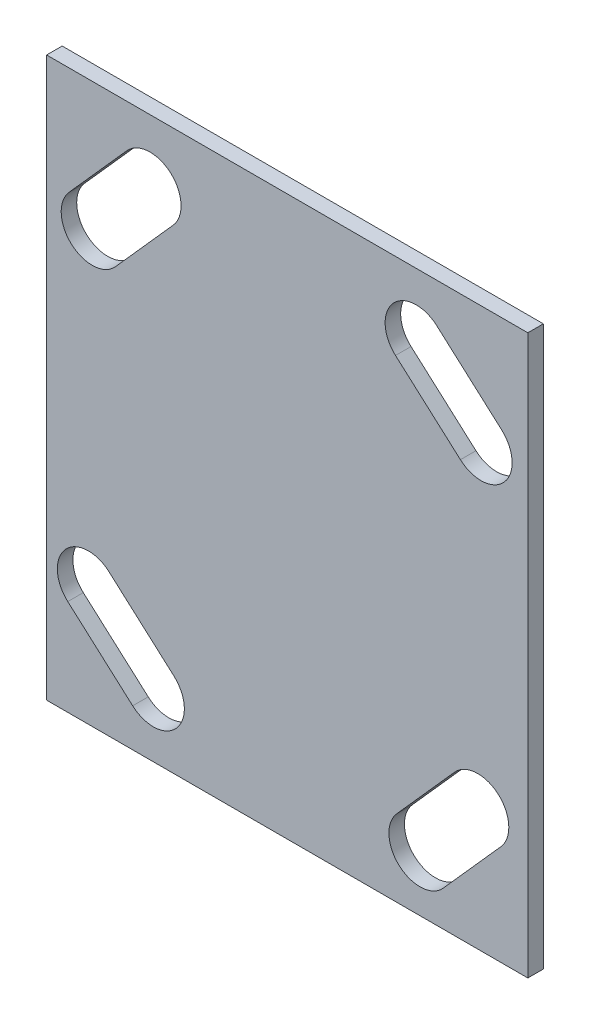
ISO-10303-21;
HEADER;
FILE_DESCRIPTION(('STEP AP214'),'2;1');
FILE_NAME('part.step','',(''),(''),'','','');
FILE_SCHEMA(('AUTOMOTIVE_DESIGN { 1 0 10303 214 1 1 1 1 }'));
ENDSEC;
DATA;
#1=APPLICATION_CONTEXT('core data for automotive mechanical design processes');
#2=APPLICATION_PROTOCOL_DEFINITION('international standard','automotive_design',2000,#1);
#3=PRODUCT_CONTEXT('',#1,'mechanical');
#4=PRODUCT('Part','Part','',(#3));
#5=PRODUCT_RELATED_PRODUCT_CATEGORY('part','',(#4));
#6=PRODUCT_DEFINITION_FORMATION('','',#4);
#7=PRODUCT_DEFINITION_CONTEXT('part definition',#1,'design');
#8=PRODUCT_DEFINITION('design','',#6,#7);
#9=PRODUCT_DEFINITION_SHAPE('','',#8);
#10=(LENGTH_UNIT() NAMED_UNIT(*) SI_UNIT(.MILLI.,.METRE.));
#11=(NAMED_UNIT(*) PLANE_ANGLE_UNIT() SI_UNIT($,.RADIAN.));
#12=(NAMED_UNIT(*) SI_UNIT($,.STERADIAN.) SOLID_ANGLE_UNIT());
#13=UNCERTAINTY_MEASURE_WITH_UNIT(LENGTH_MEASURE(1.E-05),#10,'distance_accuracy_value','');
#14=(GEOMETRIC_REPRESENTATION_CONTEXT(3) GLOBAL_UNCERTAINTY_ASSIGNED_CONTEXT((#13)) GLOBAL_UNIT_ASSIGNED_CONTEXT((#10,
#11,#12)) REPRESENTATION_CONTEXT('',''));
#15=CARTESIAN_POINT('',(0.,0.,0.));
#16=DIRECTION('',(0.,0.,1.));
#17=DIRECTION('',(1.,0.,0.));
#18=AXIS2_PLACEMENT_3D('',#15,#16,#17);
#19=CARTESIAN_POINT('',(-101.381085315594,38.1949480536358,3.175));
#20=DIRECTION('',(1.,0.,0.));
#21=DIRECTION('',(0.,1.,0.));
#22=AXIS2_PLACEMENT_3D('',#19,#20,#21);
#23=PLANE('',#22);
#24=DIRECTION('',(0.,-1.,0.));
#25=VECTOR('',#24,1.);
#26=CARTESIAN_POINT('',(-101.381085315594,38.1949480536358,0.));
#27=LINE('',#26,#25);
#28=CARTESIAN_POINT('',(-101.381085315594,38.1949480536358,0.));
#29=VERTEX_POINT('',#28);
#30=CARTESIAN_POINT('',(-101.381085315594,-76.1050519463642,0.));
#31=VERTEX_POINT('',#30);
#32=EDGE_CURVE('E301',#29,#31,#27,.T.);
#33=ORIENTED_EDGE('',*,*,#32,.T.);
#34=DIRECTION('',(0.,0.,-1.));
#35=VECTOR('',#34,1.);
#36=CARTESIAN_POINT('',(-101.381085315594,-76.1050519463642,3.175));
#37=LINE('',#36,#35);
#38=CARTESIAN_POINT('',(-101.381085315594,-76.1050519463642,3.175));
#39=VERTEX_POINT('',#38);
#40=EDGE_CURVE('E11',#39,#31,#37,.T.);
#41=ORIENTED_EDGE('',*,*,#40,.F.);
#42=DIRECTION('',(0.,-1.,0.));
#43=VECTOR('',#42,1.);
#44=CARTESIAN_POINT('',(-101.381085315594,38.1949480536358,3.175));
#45=LINE('',#44,#43);
#46=CARTESIAN_POINT('',(-101.381085315594,38.1949480536358,3.175));
#47=VERTEX_POINT('',#46);
#48=EDGE_CURVE('E308',#47,#39,#45,.T.);
#49=ORIENTED_EDGE('',*,*,#48,.F.);
#50=DIRECTION('',(0.,0.,-1.));
#51=VECTOR('',#50,1.);
#52=CARTESIAN_POINT('',(-101.381085315594,38.1949480536358,3.175));
#53=LINE('',#52,#51);
#54=EDGE_CURVE('E318',#47,#29,#53,.T.);
#55=ORIENTED_EDGE('',*,*,#54,.T.);
#56=EDGE_LOOP('',(#33,#41,#49,#55));
#57=FACE_BOUND('',#56,.T.);
#58=ADVANCED_FACE('F36',(#57),#23,.F.);
#59=CARTESIAN_POINT('',(-101.381085315594,-76.1050519463642,3.175));
#60=DIRECTION('',(0.,1.,0.));
#61=DIRECTION('',(0.,0.,1.));
#62=AXIS2_PLACEMENT_3D('',#59,#60,#61);
#63=PLANE('',#62);
#64=DIRECTION('',(1.,0.,0.));
#65=VECTOR('',#64,1.);
#66=CARTESIAN_POINT('',(-101.381085315594,-76.1050519463642,0.));
#67=LINE('',#66,#65);
#68=CARTESIAN_POINT('',(-2.95608531559406,-76.1050519463642,0.));
#69=VERTEX_POINT('',#68);
#70=EDGE_CURVE('E321',#31,#69,#67,.T.);
#71=ORIENTED_EDGE('',*,*,#70,.T.);
#72=DIRECTION('',(0.,0.,-1.));
#73=VECTOR('',#72,1.);
#74=CARTESIAN_POINT('',(-2.95608531559406,-76.1050519463642,3.175));
#75=LINE('',#74,#73);
#76=CARTESIAN_POINT('',(-2.95608531559406,-76.1050519463642,3.175));
#77=VERTEX_POINT('',#76);
#78=EDGE_CURVE('E43',#77,#69,#75,.T.);
#79=ORIENTED_EDGE('',*,*,#78,.F.);
#80=DIRECTION('',(1.,0.,0.));
#81=VECTOR('',#80,1.);
#82=CARTESIAN_POINT('',(-101.381085315594,-76.1050519463642,3.175));
#83=LINE('',#82,#81);
#84=EDGE_CURVE('E311',#39,#77,#83,.T.);
#85=ORIENTED_EDGE('',*,*,#84,.F.);
#86=ORIENTED_EDGE('',*,*,#40,.T.);
#87=EDGE_LOOP('',(#71,#79,#85,#86));
#88=FACE_BOUND('',#87,.T.);
#89=ADVANCED_FACE('F350',(#88),#63,.F.);
#90=CARTESIAN_POINT('',(-2.95608531559406,38.1949480536358,3.175));
#91=DIRECTION('',(-1.,0.,0.));
#92=DIRECTION('',(0.,0.,1.));
#93=AXIS2_PLACEMENT_3D('',#90,#91,#92);
#94=PLANE('',#93);
#95=DIRECTION('',(0.,1.,0.));
#96=VECTOR('',#95,1.);
#97=CARTESIAN_POINT('',(-2.95608531559406,38.1949480536358,0.));
#98=LINE('',#97,#96);
#99=CARTESIAN_POINT('',(-2.95608531559406,38.1949480536358,0.));
#100=VERTEX_POINT('',#99);
#101=EDGE_CURVE('E323',#69,#100,#98,.T.);
#102=ORIENTED_EDGE('',*,*,#101,.T.);
#103=DIRECTION('',(0.,0.,-1.));
#104=VECTOR('',#103,1.);
#105=CARTESIAN_POINT('',(-2.95608531559406,38.1949480536358,3.175));
#106=LINE('',#105,#104);
#107=CARTESIAN_POINT('',(-2.95608531559406,38.1949480536358,3.175));
#108=VERTEX_POINT('',#107);
#109=EDGE_CURVE('E328',#108,#100,#106,.T.);
#110=ORIENTED_EDGE('',*,*,#109,.F.);
#111=DIRECTION('',(0.,1.,0.));
#112=VECTOR('',#111,1.);
#113=CARTESIAN_POINT('',(-2.95608531559406,38.1949480536358,3.175));
#114=LINE('',#113,#112);
#115=EDGE_CURVE('E314',#77,#108,#114,.T.);
#116=ORIENTED_EDGE('',*,*,#115,.F.);
#117=ORIENTED_EDGE('',*,*,#78,.T.);
#118=EDGE_LOOP('',(#102,#110,#116,#117));
#119=FACE_BOUND('',#118,.T.);
#120=ADVANCED_FACE('F335',(#119),#94,.F.);
#121=CARTESIAN_POINT('',(-101.381085315594,38.1949480536358,3.175));
#122=DIRECTION('',(0.,-1.,0.));
#123=DIRECTION('',(0.,0.,-1.));
#124=AXIS2_PLACEMENT_3D('',#121,#122,#123);
#125=PLANE('',#124);
#126=DIRECTION('',(-1.,0.,0.));
#127=VECTOR('',#126,1.);
#128=CARTESIAN_POINT('',(-101.381085315594,38.1949480536358,0.));
#129=LINE('',#128,#127);
#130=EDGE_CURVE('E312',#100,#29,#129,.T.);
#131=ORIENTED_EDGE('',*,*,#130,.T.);
#132=ORIENTED_EDGE('',*,*,#54,.F.);
#133=DIRECTION('',(-1.,0.,0.));
#134=VECTOR('',#133,1.);
#135=CARTESIAN_POINT('',(-101.381085315594,38.1949480536358,3.175));
#136=LINE('',#135,#134);
#137=EDGE_CURVE('E316',#108,#47,#136,.T.);
#138=ORIENTED_EDGE('',*,*,#137,.F.);
#139=ORIENTED_EDGE('',*,*,#109,.T.);
#140=EDGE_LOOP('',(#131,#132,#138,#139));
#141=FACE_BOUND('',#140,.T.);
#142=ADVANCED_FACE('F343',(#141),#125,.F.);
#143=CARTESIAN_POINT('',(0.,0.,3.175));
#144=DIRECTION('',(0.,0.,1.));
#145=DIRECTION('',(1.,0.,0.));
#146=AXIS2_PLACEMENT_3D('',#143,#144,#145);
#147=PLANE('',#146);
#148=CARTESIAN_POINT('',(-25.7990286226306,25.3842942635167,3.175));
#149=DIRECTION('',(0.,0.,1.));
#150=DIRECTION('',(1.,0.,0.));
#151=AXIS2_PLACEMENT_3D('',#148,#149,#150);
#152=CIRCLE('',#151,6.35000000000003);
#153=CARTESIAN_POINT('',(-21.5761657802861,30.1266491020697,3.175));
#154=VERTEX_POINT('',#153);
#155=CARTESIAN_POINT('',(-30.0218914649752,20.6419394249638,3.175));
#156=VERTEX_POINT('',#155);
#157=EDGE_CURVE('E50',#154,#156,#152,.T.);
#158=ORIENTED_EDGE('',*,*,#157,.F.);
#159=DIRECTION('',(-0.746827533630379,0.665017770447952,0.));
#160=VECTOR('',#159,1.);
#161=CARTESIAN_POINT('',(-21.5761657802861,30.1266491020697,3.175));
#162=LINE('',#161,#160);
#163=CARTESIAN_POINT('',(-8.29757223233798,18.3026331435051,3.175));
#164=VERTEX_POINT('',#163);
#165=EDGE_CURVE('E251',#164,#154,#162,.T.);
#166=ORIENTED_EDGE('',*,*,#165,.F.);
#167=CARTESIAN_POINT('',(-12.5204350746825,13.5602783049522,3.175));
#168=DIRECTION('',(0.,0.,1.));
#169=DIRECTION('',(1.,0.,0.));
#170=AXIS2_PLACEMENT_3D('',#167,#168,#169);
#171=CIRCLE('',#170,6.35000000000004);
#172=CARTESIAN_POINT('',(-16.743297917027,8.81792346639922,3.175));
#173=VERTEX_POINT('',#172);
#174=EDGE_CURVE('E265',#173,#164,#171,.T.);
#175=ORIENTED_EDGE('',*,*,#174,.F.);
#176=DIRECTION('',(0.746827533630379,-0.665017770447953,0.));
#177=VECTOR('',#176,1.);
#178=CARTESIAN_POINT('',(-30.0218914649752,20.6419394249638,3.175));
#179=LINE('',#178,#177);
#180=EDGE_CURVE('E262',#156,#173,#179,.T.);
#181=ORIENTED_EDGE('',*,*,#180,.F.);
#182=EDGE_LOOP('',(#158,#166,#175,#181));
#183=FACE_BOUND('',#182,.T.);
#184=CARTESIAN_POINT('',(-92.8385322578294,-51.7332514877304,3.175));
#185=DIRECTION('',(0.,0.,1.));
#186=DIRECTION('',(1.,0.,0.));
#187=AXIS2_PLACEMENT_3D('',#184,#185,#186);
#188=CIRCLE('',#187,6.35000000000003);
#189=CARTESIAN_POINT('',(-88.6156694154849,-46.9908966491775,3.175));
#190=VERTEX_POINT('',#189);
#191=CARTESIAN_POINT('',(-97.0613951001739,-56.4756063262833,3.175));
#192=VERTEX_POINT('',#191);
#193=EDGE_CURVE('E58',#190,#192,#188,.T.);
#194=ORIENTED_EDGE('',*,*,#193,.F.);
#195=DIRECTION('',(-0.746827533630379,0.665017770447953,0.));
#196=VECTOR('',#195,1.);
#197=CARTESIAN_POINT('',(-88.6156694154849,-46.9908966491775,3.175));
#198=LINE('',#197,#196);
#199=CARTESIAN_POINT('',(-75.3370758675367,-58.814912607742,3.175));
#200=VERTEX_POINT('',#199);
#201=EDGE_CURVE('E221',#200,#190,#198,.T.);
#202=ORIENTED_EDGE('',*,*,#201,.F.);
#203=CARTESIAN_POINT('',(-79.5599387098813,-63.557267446295,3.175));
#204=DIRECTION('',(0.,0.,1.));
#205=DIRECTION('',(1.,0.,0.));
#206=AXIS2_PLACEMENT_3D('',#203,#204,#205);
#207=CIRCLE('',#206,6.35000000000002);
#208=CARTESIAN_POINT('',(-83.7828015522258,-68.2996222848479,3.175));
#209=VERTEX_POINT('',#208);
#210=EDGE_CURVE('E236',#209,#200,#207,.T.);
#211=ORIENTED_EDGE('',*,*,#210,.F.);
#212=DIRECTION('',(0.746827533630379,-0.665017770447952,0.));
#213=VECTOR('',#212,1.);
#214=CARTESIAN_POINT('',(-97.0613951001739,-56.4756063262833,3.175));
#215=LINE('',#214,#213);
#216=EDGE_CURVE('E232',#192,#209,#215,.T.);
#217=ORIENTED_EDGE('',*,*,#216,.F.);
#218=EDGE_LOOP('',(#194,#202,#211,#217));
#219=FACE_BOUND('',#218,.T.);
#220=CARTESIAN_POINT('',(-25.0197906283181,-64.6333282978818,3.175));
#221=DIRECTION('',(0.,0.,1.));
#222=DIRECTION('',(1.,0.,0.));
#223=AXIS2_PLACEMENT_3D('',#220,#221,#222);
#224=CIRCLE('',#223,6.34999999999999);
#225=CARTESIAN_POINT('',(-29.7621454668709,-60.4104654555373,3.175));
#226=VERTEX_POINT('',#225);
#227=CARTESIAN_POINT('',(-20.2774357897652,-68.8561911402264,3.175));
#228=VERTEX_POINT('',#227);
#229=EDGE_CURVE('E179',#226,#228,#224,.T.);
#230=ORIENTED_EDGE('',*,*,#229,.F.);
#231=DIRECTION('',(-0.66501777044796,-0.746827533630372,0.));
#232=VECTOR('',#231,1.);
#233=CARTESIAN_POINT('',(-29.7621454668709,-60.4104654555373,3.175));
#234=LINE('',#233,#232);
#235=CARTESIAN_POINT('',(-17.9381295083062,-47.1318719075893,3.175));
#236=VERTEX_POINT('',#235);
#237=EDGE_CURVE('E197',#236,#226,#234,.T.);
#238=ORIENTED_EDGE('',*,*,#237,.F.);
#239=CARTESIAN_POINT('',(-13.1957746697534,-51.3547347499338,3.175));
#240=DIRECTION('',(0.,0.,1.));
#241=DIRECTION('',(1.,0.,0.));
#242=AXIS2_PLACEMENT_3D('',#239,#240,#241);
#243=CIRCLE('',#242,6.34999999999999);
#244=CARTESIAN_POINT('',(-8.45341983120051,-55.5775975922784,3.175));
#245=VERTEX_POINT('',#244);
#246=EDGE_CURVE('E200',#245,#236,#243,.T.);
#247=ORIENTED_EDGE('',*,*,#246,.F.);
#248=DIRECTION('',(0.66501777044796,0.746827533630372,0.));
#249=VECTOR('',#248,1.);
#250=CARTESIAN_POINT('',(-20.2774357897652,-68.8561911402264,3.175));
#251=LINE('',#250,#249);
#252=EDGE_CURVE('E206',#228,#245,#251,.T.);
#253=ORIENTED_EDGE('',*,*,#252,.F.);
#254=EDGE_LOOP('',(#230,#238,#247,#253));
#255=FACE_BOUND('',#254,.T.);
#256=CARTESIAN_POINT('',(-92.0592942635168,11.9364677421707,3.175));
#257=DIRECTION('',(0.,0.,1.));
#258=DIRECTION('',(1.,0.,0.));
#259=AXIS2_PLACEMENT_3D('',#256,#257,#258);
#260=CIRCLE('',#259,6.34999999999999);
#261=CARTESIAN_POINT('',(-96.8016491020697,16.1593305845152,3.175));
#262=VERTEX_POINT('',#261);
#263=CARTESIAN_POINT('',(-87.316939424964,7.71360489982616,3.175));
#264=VERTEX_POINT('',#263);
#265=EDGE_CURVE('E213',#262,#264,#260,.T.);
#266=ORIENTED_EDGE('',*,*,#265,.F.);
#267=DIRECTION('',(-0.66501777044796,-0.746827533630372,0.));
#268=VECTOR('',#267,1.);
#269=CARTESIAN_POINT('',(-96.8016491020697,16.1593305845152,3.175));
#270=LINE('',#269,#268);
#271=CARTESIAN_POINT('',(-84.9776331435049,29.4379241324633,3.175));
#272=VERTEX_POINT('',#271);
#273=EDGE_CURVE('E280',#272,#262,#270,.T.);
#274=ORIENTED_EDGE('',*,*,#273,.F.);
#275=CARTESIAN_POINT('',(-80.2352783049521,25.2150612901187,3.175));
#276=DIRECTION('',(0.,0.,1.));
#277=DIRECTION('',(1.,0.,0.));
#278=AXIS2_PLACEMENT_3D('',#275,#276,#277);
#279=CIRCLE('',#278,6.34999999999998);
#280=CARTESIAN_POINT('',(-75.4929234663992,20.9921984477742,3.175));
#281=VERTEX_POINT('',#280);
#282=EDGE_CURVE('E294',#281,#272,#279,.T.);
#283=ORIENTED_EDGE('',*,*,#282,.F.);
#284=DIRECTION('',(0.66501777044796,0.746827533630372,0.));
#285=VECTOR('',#284,1.);
#286=CARTESIAN_POINT('',(-87.316939424964,7.71360489982616,3.175));
#287=LINE('',#286,#285);
#288=EDGE_CURVE('E291',#264,#281,#287,.T.);
#289=ORIENTED_EDGE('',*,*,#288,.F.);
#290=EDGE_LOOP('',(#266,#274,#283,#289));
#291=FACE_BOUND('',#290,.T.);
#292=ORIENTED_EDGE('',*,*,#48,.T.);
#293=ORIENTED_EDGE('',*,*,#84,.T.);
#294=ORIENTED_EDGE('',*,*,#115,.T.);
#295=ORIENTED_EDGE('',*,*,#137,.T.);
#296=EDGE_LOOP('',(#292,#293,#294,#295));
#297=FACE_BOUND('',#296,.T.);
#298=ADVANCED_FACE('F349',(#183,#219,#255,#291,#297),#147,.T.);
#299=CARTESIAN_POINT('',(0.,0.,0.));
#300=DIRECTION('',(0.,0.,1.));
#301=DIRECTION('',(1.,0.,0.));
#302=AXIS2_PLACEMENT_3D('',#299,#300,#301);
#303=PLANE('',#302);
#304=DIRECTION('',(-0.746827533630379,0.665017770447952,0.));
#305=VECTOR('',#304,1.);
#306=CARTESIAN_POINT('',(-21.5761657802861,30.1266491020697,0.));
#307=LINE('',#306,#305);
#308=CARTESIAN_POINT('',(-8.29757223233798,18.3026331435051,0.));
#309=VERTEX_POINT('',#308);
#310=CARTESIAN_POINT('',(-21.5761657802861,30.1266491020697,0.));
#311=VERTEX_POINT('',#310);
#312=EDGE_CURVE('E257',#309,#311,#307,.T.);
#313=ORIENTED_EDGE('',*,*,#312,.T.);
#314=CARTESIAN_POINT('',(-25.7990286226306,25.3842942635167,0.));
#315=DIRECTION('',(0.,0.,1.));
#316=DIRECTION('',(1.,0.,0.));
#317=AXIS2_PLACEMENT_3D('',#314,#315,#316);
#318=CIRCLE('',#317,6.35000000000003);
#319=CARTESIAN_POINT('',(-30.0218914649752,20.6419394249638,0.));
#320=VERTEX_POINT('',#319);
#321=EDGE_CURVE('E247',#311,#320,#318,.T.);
#322=ORIENTED_EDGE('',*,*,#321,.T.);
#323=DIRECTION('',(0.746827533630379,-0.665017770447953,0.));
#324=VECTOR('',#323,1.);
#325=CARTESIAN_POINT('',(-30.0218914649752,20.6419394249638,0.));
#326=LINE('',#325,#324);
#327=CARTESIAN_POINT('',(-16.743297917027,8.81792346639922,0.));
#328=VERTEX_POINT('',#327);
#329=EDGE_CURVE('E250',#320,#328,#326,.T.);
#330=ORIENTED_EDGE('',*,*,#329,.T.);
#331=CARTESIAN_POINT('',(-12.5204350746825,13.5602783049522,0.));
#332=DIRECTION('',(0.,0.,1.));
#333=DIRECTION('',(1.,0.,0.));
#334=AXIS2_PLACEMENT_3D('',#331,#332,#333);
#335=CIRCLE('',#334,6.35000000000004);
#336=EDGE_CURVE('E254',#328,#309,#335,.T.);
#337=ORIENTED_EDGE('',*,*,#336,.T.);
#338=EDGE_LOOP('',(#313,#322,#330,#337));
#339=FACE_BOUND('',#338,.T.);
#340=DIRECTION('',(-0.746827533630379,0.665017770447953,0.));
#341=VECTOR('',#340,1.);
#342=CARTESIAN_POINT('',(-88.6156694154849,-46.9908966491775,0.));
#343=LINE('',#342,#341);
#344=CARTESIAN_POINT('',(-75.3370758675367,-58.814912607742,0.));
#345=VERTEX_POINT('',#344);
#346=CARTESIAN_POINT('',(-88.6156694154849,-46.9908966491775,0.));
#347=VERTEX_POINT('',#346);
#348=EDGE_CURVE('E227',#345,#347,#343,.T.);
#349=ORIENTED_EDGE('',*,*,#348,.T.);
#350=CARTESIAN_POINT('',(-92.8385322578294,-51.7332514877304,0.));
#351=DIRECTION('',(0.,0.,1.));
#352=DIRECTION('',(1.,0.,0.));
#353=AXIS2_PLACEMENT_3D('',#350,#351,#352);
#354=CIRCLE('',#353,6.35000000000003);
#355=CARTESIAN_POINT('',(-97.0613951001739,-56.4756063262833,0.));
#356=VERTEX_POINT('',#355);
#357=EDGE_CURVE('E217',#347,#356,#354,.T.);
#358=ORIENTED_EDGE('',*,*,#357,.T.);
#359=DIRECTION('',(0.746827533630379,-0.665017770447952,0.));
#360=VECTOR('',#359,1.);
#361=CARTESIAN_POINT('',(-97.0613951001739,-56.4756063262833,0.));
#362=LINE('',#361,#360);
#363=CARTESIAN_POINT('',(-83.7828015522258,-68.2996222848479,0.));
#364=VERTEX_POINT('',#363);
#365=EDGE_CURVE('E220',#356,#364,#362,.T.);
#366=ORIENTED_EDGE('',*,*,#365,.T.);
#367=CARTESIAN_POINT('',(-79.5599387098813,-63.557267446295,0.));
#368=DIRECTION('',(0.,0.,1.));
#369=DIRECTION('',(1.,0.,0.));
#370=AXIS2_PLACEMENT_3D('',#367,#368,#369);
#371=CIRCLE('',#370,6.35000000000002);
#372=EDGE_CURVE('E224',#364,#345,#371,.T.);
#373=ORIENTED_EDGE('',*,*,#372,.T.);
#374=EDGE_LOOP('',(#349,#358,#366,#373));
#375=FACE_BOUND('',#374,.T.);
#376=DIRECTION('',(-0.66501777044796,-0.746827533630372,0.));
#377=VECTOR('',#376,1.);
#378=CARTESIAN_POINT('',(-29.7621454668709,-60.4104654555373,0.));
#379=LINE('',#378,#377);
#380=CARTESIAN_POINT('',(-17.9381295083062,-47.1318719075893,0.));
#381=VERTEX_POINT('',#380);
#382=CARTESIAN_POINT('',(-29.7621454668709,-60.4104654555373,0.));
#383=VERTEX_POINT('',#382);
#384=EDGE_CURVE('E184',#381,#383,#379,.T.);
#385=ORIENTED_EDGE('',*,*,#384,.T.);
#386=CARTESIAN_POINT('',(-25.0197906283181,-64.6333282978818,0.));
#387=DIRECTION('',(0.,0.,1.));
#388=DIRECTION('',(1.,0.,0.));
#389=AXIS2_PLACEMENT_3D('',#386,#387,#388);
#390=CIRCLE('',#389,6.34999999999999);
#391=CARTESIAN_POINT('',(-20.2774357897652,-68.8561911402264,0.));
#392=VERTEX_POINT('',#391);
#393=EDGE_CURVE('E176',#383,#392,#390,.T.);
#394=ORIENTED_EDGE('',*,*,#393,.T.);
#395=DIRECTION('',(0.66501777044796,0.746827533630372,0.));
#396=VECTOR('',#395,1.);
#397=CARTESIAN_POINT('',(-20.2774357897652,-68.8561911402264,0.));
#398=LINE('',#397,#396);
#399=CARTESIAN_POINT('',(-8.45341983120052,-55.5775975922784,0.));
#400=VERTEX_POINT('',#399);
#401=EDGE_CURVE('E188',#392,#400,#398,.T.);
#402=ORIENTED_EDGE('',*,*,#401,.T.);
#403=CARTESIAN_POINT('',(-13.1957746697534,-51.3547347499338,0.));
#404=DIRECTION('',(0.,0.,1.));
#405=DIRECTION('',(1.,0.,0.));
#406=AXIS2_PLACEMENT_3D('',#403,#404,#405);
#407=CIRCLE('',#406,6.34999999999999);
#408=EDGE_CURVE('E192',#400,#381,#407,.T.);
#409=ORIENTED_EDGE('',*,*,#408,.T.);
#410=EDGE_LOOP('',(#385,#394,#402,#409));
#411=FACE_BOUND('',#410,.T.);
#412=DIRECTION('',(-0.66501777044796,-0.746827533630372,0.));
#413=VECTOR('',#412,1.);
#414=CARTESIAN_POINT('',(-96.8016491020697,16.1593305845152,0.));
#415=LINE('',#414,#413);
#416=CARTESIAN_POINT('',(-84.9776331435049,29.4379241324633,0.));
#417=VERTEX_POINT('',#416);
#418=CARTESIAN_POINT('',(-96.8016491020697,16.1593305845152,0.));
#419=VERTEX_POINT('',#418);
#420=EDGE_CURVE('E286',#417,#419,#415,.T.);
#421=ORIENTED_EDGE('',*,*,#420,.T.);
#422=CARTESIAN_POINT('',(-92.0592942635168,11.9364677421707,0.));
#423=DIRECTION('',(0.,0.,1.));
#424=DIRECTION('',(1.,0.,0.));
#425=AXIS2_PLACEMENT_3D('',#422,#423,#424);
#426=CIRCLE('',#425,6.34999999999999);
#427=CARTESIAN_POINT('',(-87.316939424964,7.71360489982616,0.));
#428=VERTEX_POINT('',#427);
#429=EDGE_CURVE('E276',#419,#428,#426,.T.);
#430=ORIENTED_EDGE('',*,*,#429,.T.);
#431=DIRECTION('',(0.66501777044796,0.746827533630372,0.));
#432=VECTOR('',#431,1.);
#433=CARTESIAN_POINT('',(-87.316939424964,7.71360489982616,0.));
#434=LINE('',#433,#432);
#435=CARTESIAN_POINT('',(-75.4929234663993,20.9921984477742,0.));
#436=VERTEX_POINT('',#435);
#437=EDGE_CURVE('E279',#428,#436,#434,.T.);
#438=ORIENTED_EDGE('',*,*,#437,.T.);
#439=CARTESIAN_POINT('',(-80.2352783049521,25.2150612901187,0.));
#440=DIRECTION('',(0.,0.,1.));
#441=DIRECTION('',(1.,0.,0.));
#442=AXIS2_PLACEMENT_3D('',#439,#440,#441);
#443=CIRCLE('',#442,6.34999999999998);
#444=EDGE_CURVE('E283',#436,#417,#443,.T.);
#445=ORIENTED_EDGE('',*,*,#444,.T.);
#446=EDGE_LOOP('',(#421,#430,#438,#445));
#447=FACE_BOUND('',#446,.T.);
#448=ORIENTED_EDGE('',*,*,#32,.F.);
#449=ORIENTED_EDGE('',*,*,#130,.F.);
#450=ORIENTED_EDGE('',*,*,#101,.F.);
#451=ORIENTED_EDGE('',*,*,#70,.F.);
#452=EDGE_LOOP('',(#448,#449,#450,#451));
#453=FACE_BOUND('',#452,.T.);
#454=ADVANCED_FACE('F194',(#339,#375,#411,#447,#453),#303,.F.);
#455=CARTESIAN_POINT('',(-92.0592942635168,11.9364677421707,0.));
#456=DIRECTION('',(0.,0.,1.));
#457=DIRECTION('',(1.,0.,0.));
#458=AXIS2_PLACEMENT_3D('',#455,#456,#457);
#459=CYLINDRICAL_SURFACE('',#458,6.34999999999999);
#460=ORIENTED_EDGE('',*,*,#265,.T.);
#461=DIRECTION('',(0.,0.,1.));
#462=VECTOR('',#461,1.);
#463=CARTESIAN_POINT('',(-87.316939424964,7.71360489982616,0.));
#464=LINE('',#463,#462);
#465=EDGE_CURVE('E289',#428,#264,#464,.T.);
#466=ORIENTED_EDGE('',*,*,#465,.F.);
#467=ORIENTED_EDGE('',*,*,#429,.F.);
#468=DIRECTION('',(0.,0.,1.));
#469=VECTOR('',#468,1.);
#470=CARTESIAN_POINT('',(-96.8016491020697,16.1593305845152,0.));
#471=LINE('',#470,#469);
#472=EDGE_CURVE('E299',#419,#262,#471,.T.);
#473=ORIENTED_EDGE('',*,*,#472,.T.);
#474=EDGE_LOOP('',(#460,#466,#467,#473));
#475=FACE_BOUND('',#474,.T.);
#476=ADVANCED_FACE('F362',(#475),#459,.F.);
#477=CARTESIAN_POINT('',(-96.8016491020697,16.1593305845152,0.));
#478=DIRECTION('',(-0.746827533630372,0.66501777044796,0.));
#479=DIRECTION('',(-0.66501777044796,-0.746827533630372,0.));
#480=AXIS2_PLACEMENT_3D('',#477,#478,#479);
#481=PLANE('',#480);
#482=ORIENTED_EDGE('',*,*,#273,.T.);
#483=ORIENTED_EDGE('',*,*,#472,.F.);
#484=ORIENTED_EDGE('',*,*,#420,.F.);
#485=DIRECTION('',(0.,0.,1.));
#486=VECTOR('',#485,1.);
#487=CARTESIAN_POINT('',(-84.9776331435049,29.4379241324633,0.));
#488=LINE('',#487,#486);
#489=EDGE_CURVE('E302',#417,#272,#488,.T.);
#490=ORIENTED_EDGE('',*,*,#489,.T.);
#491=EDGE_LOOP('',(#482,#483,#484,#490));
#492=FACE_BOUND('',#491,.T.);
#493=ADVANCED_FACE('F369',(#492),#481,.F.);
#494=CARTESIAN_POINT('',(-80.2352783049521,25.2150612901187,0.));
#495=DIRECTION('',(0.,0.,1.));
#496=DIRECTION('',(1.,0.,0.));
#497=AXIS2_PLACEMENT_3D('',#494,#495,#496);
#498=CYLINDRICAL_SURFACE('',#497,6.34999999999998);
#499=ORIENTED_EDGE('',*,*,#282,.T.);
#500=ORIENTED_EDGE('',*,*,#489,.F.);
#501=ORIENTED_EDGE('',*,*,#444,.F.);
#502=DIRECTION('',(0.,0.,1.));
#503=VECTOR('',#502,1.);
#504=CARTESIAN_POINT('',(-75.4929234663992,20.9921984477742,0.));
#505=LINE('',#504,#503);
#506=EDGE_CURVE('E304',#436,#281,#505,.T.);
#507=ORIENTED_EDGE('',*,*,#506,.T.);
#508=EDGE_LOOP('',(#499,#500,#501,#507));
#509=FACE_BOUND('',#508,.T.);
#510=ADVANCED_FACE('F374',(#509),#498,.F.);
#511=CARTESIAN_POINT('',(-87.316939424964,7.71360489982616,0.));
#512=DIRECTION('',(0.746827533630372,-0.66501777044796,0.));
#513=DIRECTION('',(0.66501777044796,0.746827533630372,0.));
#514=AXIS2_PLACEMENT_3D('',#511,#512,#513);
#515=PLANE('',#514);
#516=ORIENTED_EDGE('',*,*,#288,.T.);
#517=ORIENTED_EDGE('',*,*,#506,.F.);
#518=ORIENTED_EDGE('',*,*,#437,.F.);
#519=ORIENTED_EDGE('',*,*,#465,.T.);
#520=EDGE_LOOP('',(#516,#517,#518,#519));
#521=FACE_BOUND('',#520,.T.);
#522=ADVANCED_FACE('F371',(#521),#515,.F.);
#523=CARTESIAN_POINT('',(-25.0197906283181,-64.6333282978818,0.));
#524=DIRECTION('',(0.,0.,1.));
#525=DIRECTION('',(1.,0.,0.));
#526=AXIS2_PLACEMENT_3D('',#523,#524,#525);
#527=CYLINDRICAL_SURFACE('',#526,6.34999999999999);
#528=ORIENTED_EDGE('',*,*,#229,.T.);
#529=DIRECTION('',(0.,0.,1.));
#530=VECTOR('',#529,1.);
#531=CARTESIAN_POINT('',(-20.2774357897652,-68.8561911402264,0.));
#532=LINE('',#531,#530);
#533=EDGE_CURVE('E172',#392,#228,#532,.T.);
#534=ORIENTED_EDGE('',*,*,#533,.F.);
#535=ORIENTED_EDGE('',*,*,#393,.F.);
#536=DIRECTION('',(0.,0.,1.));
#537=VECTOR('',#536,1.);
#538=CARTESIAN_POINT('',(-29.7621454668709,-60.4104654555373,0.));
#539=LINE('',#538,#537);
#540=EDGE_CURVE('E211',#383,#226,#539,.T.);
#541=ORIENTED_EDGE('',*,*,#540,.T.);
#542=EDGE_LOOP('',(#528,#534,#535,#541));
#543=FACE_BOUND('',#542,.T.);
#544=ADVANCED_FACE('F174',(#543),#527,.F.);
#545=CARTESIAN_POINT('',(-29.7621454668709,-60.4104654555373,0.));
#546=DIRECTION('',(-0.746827533630372,0.66501777044796,0.));
#547=DIRECTION('',(-0.66501777044796,-0.746827533630372,0.));
#548=AXIS2_PLACEMENT_3D('',#545,#546,#547);
#549=PLANE('',#548);
#550=ORIENTED_EDGE('',*,*,#237,.T.);
#551=ORIENTED_EDGE('',*,*,#540,.F.);
#552=ORIENTED_EDGE('',*,*,#384,.F.);
#553=DIRECTION('',(0.,0.,1.));
#554=VECTOR('',#553,1.);
#555=CARTESIAN_POINT('',(-17.9381295083062,-47.1318719075893,0.));
#556=LINE('',#555,#554);
#557=EDGE_CURVE('E214',#381,#236,#556,.T.);
#558=ORIENTED_EDGE('',*,*,#557,.T.);
#559=EDGE_LOOP('',(#550,#551,#552,#558));
#560=FACE_BOUND('',#559,.T.);
#561=ADVANCED_FACE('F414',(#560),#549,.F.);
#562=CARTESIAN_POINT('',(-13.1957746697534,-51.3547347499338,0.));
#563=DIRECTION('',(0.,0.,1.));
#564=DIRECTION('',(1.,0.,0.));
#565=AXIS2_PLACEMENT_3D('',#562,#563,#564);
#566=CYLINDRICAL_SURFACE('',#565,6.34999999999999);
#567=ORIENTED_EDGE('',*,*,#246,.T.);
#568=ORIENTED_EDGE('',*,*,#557,.F.);
#569=ORIENTED_EDGE('',*,*,#408,.F.);
#570=DIRECTION('',(0.,0.,1.));
#571=VECTOR('',#570,1.);
#572=CARTESIAN_POINT('',(-8.45341983120051,-55.5775975922784,0.));
#573=LINE('',#572,#571);
#574=EDGE_CURVE('E183',#400,#245,#573,.T.);
#575=ORIENTED_EDGE('',*,*,#574,.T.);
#576=EDGE_LOOP('',(#567,#568,#569,#575));
#577=FACE_BOUND('',#576,.T.);
#578=ADVANCED_FACE('F417',(#577),#566,.F.);
#579=CARTESIAN_POINT('',(-20.2774357897652,-68.8561911402264,0.));
#580=DIRECTION('',(0.746827533630372,-0.66501777044796,0.));
#581=DIRECTION('',(0.66501777044796,0.746827533630372,0.));
#582=AXIS2_PLACEMENT_3D('',#579,#580,#581);
#583=PLANE('',#582);
#584=ORIENTED_EDGE('',*,*,#252,.T.);
#585=ORIENTED_EDGE('',*,*,#574,.F.);
#586=ORIENTED_EDGE('',*,*,#401,.F.);
#587=ORIENTED_EDGE('',*,*,#533,.T.);
#588=EDGE_LOOP('',(#584,#585,#586,#587));
#589=FACE_BOUND('',#588,.T.);
#590=ADVANCED_FACE('F189',(#589),#583,.F.);
#591=CARTESIAN_POINT('',(-92.8385322578294,-51.7332514877304,0.));
#592=DIRECTION('',(0.,0.,1.));
#593=DIRECTION('',(1.,0.,0.));
#594=AXIS2_PLACEMENT_3D('',#591,#592,#593);
#595=CYLINDRICAL_SURFACE('',#594,6.35000000000003);
#596=ORIENTED_EDGE('',*,*,#193,.T.);
#597=DIRECTION('',(0.,0.,1.));
#598=VECTOR('',#597,1.);
#599=CARTESIAN_POINT('',(-97.0613951001739,-56.4756063262833,0.));
#600=LINE('',#599,#598);
#601=EDGE_CURVE('E230',#356,#192,#600,.T.);
#602=ORIENTED_EDGE('',*,*,#601,.F.);
#603=ORIENTED_EDGE('',*,*,#357,.F.);
#604=DIRECTION('',(0.,0.,1.));
#605=VECTOR('',#604,1.);
#606=CARTESIAN_POINT('',(-88.6156694154849,-46.9908966491775,0.));
#607=LINE('',#606,#605);
#608=EDGE_CURVE('E207',#347,#190,#607,.T.);
#609=ORIENTED_EDGE('',*,*,#608,.T.);
#610=EDGE_LOOP('',(#596,#602,#603,#609));
#611=FACE_BOUND('',#610,.T.);
#612=ADVANCED_FACE('F398',(#611),#595,.F.);
#613=CARTESIAN_POINT('',(-88.6156694154849,-46.9908966491775,0.));
#614=DIRECTION('',(0.665017770447953,0.746827533630379,0.));
#615=DIRECTION('',(-0.746827533630379,0.665017770447953,0.));
#616=AXIS2_PLACEMENT_3D('',#613,#614,#615);
#617=PLANE('',#616);
#618=ORIENTED_EDGE('',*,*,#201,.T.);
#619=ORIENTED_EDGE('',*,*,#608,.F.);
#620=ORIENTED_EDGE('',*,*,#348,.F.);
#621=DIRECTION('',(0.,0.,1.));
#622=VECTOR('',#621,1.);
#623=CARTESIAN_POINT('',(-75.3370758675367,-58.814912607742,0.));
#624=LINE('',#623,#622);
#625=EDGE_CURVE('E242',#345,#200,#624,.T.);
#626=ORIENTED_EDGE('',*,*,#625,.T.);
#627=EDGE_LOOP('',(#618,#619,#620,#626));
#628=FACE_BOUND('',#627,.T.);
#629=ADVANCED_FACE('F401',(#628),#617,.F.);
#630=CARTESIAN_POINT('',(-79.5599387098813,-63.557267446295,0.));
#631=DIRECTION('',(0.,0.,1.));
#632=DIRECTION('',(1.,0.,0.));
#633=AXIS2_PLACEMENT_3D('',#630,#631,#632);
#634=CYLINDRICAL_SURFACE('',#633,6.35000000000002);
#635=ORIENTED_EDGE('',*,*,#210,.T.);
#636=ORIENTED_EDGE('',*,*,#625,.F.);
#637=ORIENTED_EDGE('',*,*,#372,.F.);
#638=DIRECTION('',(0.,0.,1.));
#639=VECTOR('',#638,1.);
#640=CARTESIAN_POINT('',(-83.7828015522258,-68.2996222848479,0.));
#641=LINE('',#640,#639);
#642=EDGE_CURVE('E244',#364,#209,#641,.T.);
#643=ORIENTED_EDGE('',*,*,#642,.T.);
#644=EDGE_LOOP('',(#635,#636,#637,#643));
#645=FACE_BOUND('',#644,.T.);
#646=ADVANCED_FACE('F404',(#645),#634,.F.);
#647=CARTESIAN_POINT('',(-97.0613951001739,-56.4756063262833,0.));
#648=DIRECTION('',(-0.665017770447952,-0.746827533630379,0.));
#649=DIRECTION('',(0.746827533630379,-0.665017770447952,0.));
#650=AXIS2_PLACEMENT_3D('',#647,#648,#649);
#651=PLANE('',#650);
#652=ORIENTED_EDGE('',*,*,#216,.T.);
#653=ORIENTED_EDGE('',*,*,#642,.F.);
#654=ORIENTED_EDGE('',*,*,#365,.F.);
#655=ORIENTED_EDGE('',*,*,#601,.T.);
#656=EDGE_LOOP('',(#652,#653,#654,#655));
#657=FACE_BOUND('',#656,.T.);
#658=ADVANCED_FACE('F386',(#657),#651,.F.);
#659=CARTESIAN_POINT('',(-25.7990286226306,25.3842942635167,0.));
#660=DIRECTION('',(0.,0.,1.));
#661=DIRECTION('',(1.,0.,0.));
#662=AXIS2_PLACEMENT_3D('',#659,#660,#661);
#663=CYLINDRICAL_SURFACE('',#662,6.35000000000003);
#664=ORIENTED_EDGE('',*,*,#157,.T.);
#665=DIRECTION('',(0.,0.,1.));
#666=VECTOR('',#665,1.);
#667=CARTESIAN_POINT('',(-30.0218914649752,20.6419394249638,0.));
#668=LINE('',#667,#666);
#669=EDGE_CURVE('E260',#320,#156,#668,.T.);
#670=ORIENTED_EDGE('',*,*,#669,.F.);
#671=ORIENTED_EDGE('',*,*,#321,.F.);
#672=DIRECTION('',(0.,0.,1.));
#673=VECTOR('',#672,1.);
#674=CARTESIAN_POINT('',(-21.5761657802861,30.1266491020697,0.));
#675=LINE('',#674,#673);
#676=EDGE_CURVE('E233',#311,#154,#675,.T.);
#677=ORIENTED_EDGE('',*,*,#676,.T.);
#678=EDGE_LOOP('',(#664,#670,#671,#677));
#679=FACE_BOUND('',#678,.T.);
#680=ADVANCED_FACE('F382',(#679),#663,.F.);
#681=CARTESIAN_POINT('',(-21.5761657802861,30.1266491020697,0.));
#682=DIRECTION('',(0.665017770447952,0.746827533630379,0.));
#683=DIRECTION('',(-0.746827533630379,0.665017770447952,0.));
#684=AXIS2_PLACEMENT_3D('',#681,#682,#683);
#685=PLANE('',#684);
#686=ORIENTED_EDGE('',*,*,#165,.T.);
#687=ORIENTED_EDGE('',*,*,#676,.F.);
#688=ORIENTED_EDGE('',*,*,#312,.F.);
#689=DIRECTION('',(0.,0.,1.));
#690=VECTOR('',#689,1.);
#691=CARTESIAN_POINT('',(-8.29757223233798,18.3026331435051,0.));
#692=LINE('',#691,#690);
#693=EDGE_CURVE('E271',#309,#164,#692,.T.);
#694=ORIENTED_EDGE('',*,*,#693,.T.);
#695=EDGE_LOOP('',(#686,#687,#688,#694));
#696=FACE_BOUND('',#695,.T.);
#697=ADVANCED_FACE('F385',(#696),#685,.F.);
#698=CARTESIAN_POINT('',(-12.5204350746825,13.5602783049522,0.));
#699=DIRECTION('',(0.,0.,1.));
#700=DIRECTION('',(1.,0.,0.));
#701=AXIS2_PLACEMENT_3D('',#698,#699,#700);
#702=CYLINDRICAL_SURFACE('',#701,6.35000000000004);
#703=ORIENTED_EDGE('',*,*,#174,.T.);
#704=ORIENTED_EDGE('',*,*,#693,.F.);
#705=ORIENTED_EDGE('',*,*,#336,.F.);
#706=DIRECTION('',(0.,0.,1.));
#707=VECTOR('',#706,1.);
#708=CARTESIAN_POINT('',(-16.743297917027,8.81792346639922,0.));
#709=LINE('',#708,#707);
#710=EDGE_CURVE('E273',#328,#173,#709,.T.);
#711=ORIENTED_EDGE('',*,*,#710,.T.);
#712=EDGE_LOOP('',(#703,#704,#705,#711));
#713=FACE_BOUND('',#712,.T.);
#714=ADVANCED_FACE('F390',(#713),#702,.F.);
#715=CARTESIAN_POINT('',(-30.0218914649752,20.6419394249638,0.));
#716=DIRECTION('',(-0.665017770447952,-0.746827533630379,0.));
#717=DIRECTION('',(0.746827533630379,-0.665017770447953,0.));
#718=AXIS2_PLACEMENT_3D('',#715,#716,#717);
#719=PLANE('',#718);
#720=ORIENTED_EDGE('',*,*,#180,.T.);
#721=ORIENTED_EDGE('',*,*,#710,.F.);
#722=ORIENTED_EDGE('',*,*,#329,.F.);
#723=ORIENTED_EDGE('',*,*,#669,.T.);
#724=EDGE_LOOP('',(#720,#721,#722,#723));
#725=FACE_BOUND('',#724,.T.);
#726=ADVANCED_FACE('F387',(#725),#719,.F.);
#727=CLOSED_SHELL('',(#58,#89,#120,#142,#298,#454,#476,#493,#510,#522,#544,#561,#578,#590,#612,
#629,#646,#658,#680,#697,#714,#726));
#728=MANIFOLD_SOLID_BREP('B2',#727);
#729=ADVANCED_BREP_SHAPE_REPRESENTATION('',(#18,#728),#14);
#730=SHAPE_DEFINITION_REPRESENTATION(#9,#729);
ENDSEC;
END-ISO-10303-21;
